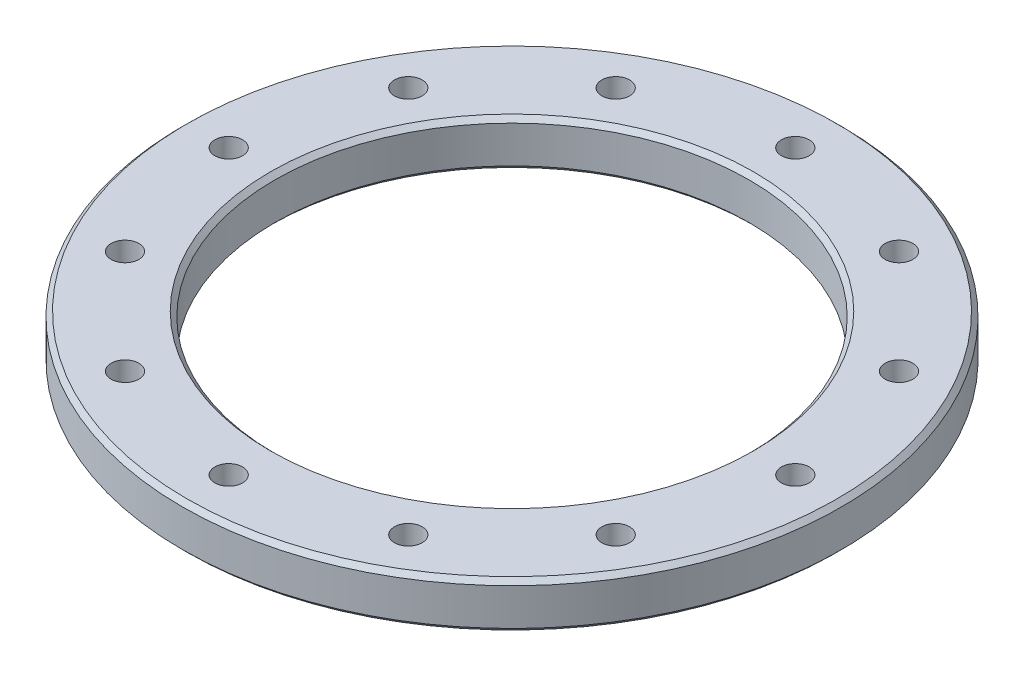
ISO-10303-21;
HEADER;
FILE_DESCRIPTION(('STEP AP214'),'2;1');
FILE_NAME('part.step','',(''),(''),'','','');
FILE_SCHEMA(('AUTOMOTIVE_DESIGN { 1 0 10303 214 1 1 1 1 }'));
ENDSEC;
DATA;
#1=APPLICATION_CONTEXT('core data for automotive mechanical design processes');
#2=APPLICATION_PROTOCOL_DEFINITION('international standard','automotive_design',2000,#1);
#3=PRODUCT_CONTEXT('',#1,'mechanical');
#4=PRODUCT('Part','Part','',(#3));
#5=PRODUCT_RELATED_PRODUCT_CATEGORY('part','',(#4));
#6=PRODUCT_DEFINITION_FORMATION('','',#4);
#7=PRODUCT_DEFINITION_CONTEXT('part definition',#1,'design');
#8=PRODUCT_DEFINITION('design','',#6,#7);
#9=PRODUCT_DEFINITION_SHAPE('','',#8);
#10=(LENGTH_UNIT() NAMED_UNIT(*) SI_UNIT(.MILLI.,.METRE.));
#11=(NAMED_UNIT(*) PLANE_ANGLE_UNIT() SI_UNIT($,.RADIAN.));
#12=(NAMED_UNIT(*) SI_UNIT($,.STERADIAN.) SOLID_ANGLE_UNIT());
#13=UNCERTAINTY_MEASURE_WITH_UNIT(LENGTH_MEASURE(1.E-05),#10,'distance_accuracy_value','');
#14=(GEOMETRIC_REPRESENTATION_CONTEXT(3) GLOBAL_UNCERTAINTY_ASSIGNED_CONTEXT((#13)) GLOBAL_UNIT_ASSIGNED_CONTEXT((#10,
#11,#12)) REPRESENTATION_CONTEXT('',''));
#15=CARTESIAN_POINT('',(0.,0.,0.));
#16=DIRECTION('',(0.,0.,1.));
#17=DIRECTION('',(1.,0.,0.));
#18=AXIS2_PLACEMENT_3D('',#15,#16,#17);
#19=CARTESIAN_POINT('',(0.,5.,0.));
#20=DIRECTION('',(0.,1.,0.));
#21=DIRECTION('',(0.,0.,1.));
#22=AXIS2_PLACEMENT_3D('',#19,#20,#21);
#23=PLANE('',#22);
#24=CARTESIAN_POINT('',(0.,5.,0.));
#25=DIRECTION('',(0.,1.,0.));
#26=DIRECTION('',(0.,0.,1.));
#27=AXIS2_PLACEMENT_3D('',#24,#25,#26);
#28=CIRCLE('',#27,35.125);
#29=CARTESIAN_POINT('',(0.,5.,35.125));
#30=VERTEX_POINT('',#29);
#31=EDGE_CURVE('E10',#30,#30,#28,.T.);
#32=ORIENTED_EDGE('',*,*,#31,.T.);
#33=EDGE_LOOP('',(#32));
#34=FACE_BOUND('',#33,.T.);
#35=CARTESIAN_POINT('',(0.,5.,0.));
#36=DIRECTION('',(0.,1.,0.));
#37=DIRECTION('',(0.,0.,1.));
#38=AXIS2_PLACEMENT_3D('',#35,#36,#37);
#39=CIRCLE('',#38,26.125);
#40=CARTESIAN_POINT('',(0.,5.,26.125));
#41=VERTEX_POINT('',#40);
#42=EDGE_CURVE('E38',#41,#41,#39,.F.);
#43=ORIENTED_EDGE('',*,*,#42,.T.);
#44=EDGE_LOOP('',(#43));
#45=FACE_BOUND('',#44,.T.);
#46=CARTESIAN_POINT('',(-26.5220279908985,5.,-15.3124999999999));
#47=DIRECTION('',(0.,1.,0.));
#48=DIRECTION('',(0.86602540378444,0.,0.499999999999998));
#49=AXIS2_PLACEMENT_3D('',#46,#47,#48);
#50=CIRCLE('',#49,1.5);
#51=CARTESIAN_POINT('',(-25.2229898852218,5.,-14.5624999999999));
#52=VERTEX_POINT('',#51);
#53=EDGE_CURVE('E117',#52,#52,#50,.T.);
#54=ORIENTED_EDGE('',*,*,#53,.F.);
#55=EDGE_LOOP('',(#54));
#56=FACE_BOUND('',#55,.T.);
#57=CARTESIAN_POINT('',(-30.625,5.,1.08495694713479E-13));
#58=DIRECTION('',(0.,1.,0.));
#59=DIRECTION('',(1.,0.,0.));
#60=AXIS2_PLACEMENT_3D('',#57,#58,#59);
#61=CIRCLE('',#60,1.5);
#62=CARTESIAN_POINT('',(-29.125,5.,1.03258472705214E-13));
#63=VERTEX_POINT('',#62);
#64=EDGE_CURVE('E111',#63,#63,#61,.T.);
#65=ORIENTED_EDGE('',*,*,#64,.F.);
#66=EDGE_LOOP('',(#65));
#67=FACE_BOUND('',#66,.T.);
#68=CARTESIAN_POINT('',(-26.5220279908984,5.,15.3125000000001));
#69=DIRECTION('',(0.,1.,0.));
#70=DIRECTION('',(0.866025403784436,0.,-0.500000000000004));
#71=AXIS2_PLACEMENT_3D('',#68,#69,#70);
#72=CIRCLE('',#71,1.5);
#73=CARTESIAN_POINT('',(-25.2229898852217,5.,14.5625000000001));
#74=VERTEX_POINT('',#73);
#75=EDGE_CURVE('E105',#74,#74,#72,.T.);
#76=ORIENTED_EDGE('',*,*,#75,.F.);
#77=EDGE_LOOP('',(#76));
#78=FACE_BOUND('',#77,.T.);
#79=CARTESIAN_POINT('',(-15.3124999999998,5.,26.5220279908985));
#80=DIRECTION('',(0.,1.,0.));
#81=DIRECTION('',(0.499999999999995,0.,-0.866025403784442));
#82=AXIS2_PLACEMENT_3D('',#79,#80,#81);
#83=CIRCLE('',#82,1.5);
#84=CARTESIAN_POINT('',(-14.5624999999999,5.,25.2229898852219));
#85=VERTEX_POINT('',#84);
#86=EDGE_CURVE('E99',#85,#85,#83,.T.);
#87=ORIENTED_EDGE('',*,*,#86,.F.);
#88=EDGE_LOOP('',(#87));
#89=FACE_BOUND('',#88,.T.);
#90=CARTESIAN_POINT('',(0.,5.,30.625));
#91=DIRECTION('',(0.,1.,0.));
#92=DIRECTION('',(0.,0.,-1.));
#93=AXIS2_PLACEMENT_3D('',#90,#91,#92);
#94=CIRCLE('',#93,1.5);
#95=CARTESIAN_POINT('',(0.,5.,29.125));
#96=VERTEX_POINT('',#95);
#97=EDGE_CURVE('E93',#96,#96,#94,.T.);
#98=ORIENTED_EDGE('',*,*,#97,.F.);
#99=EDGE_LOOP('',(#98));
#100=FACE_BOUND('',#99,.T.);
#101=CARTESIAN_POINT('',(15.3125000000002,5.,26.5220279908983));
#102=DIRECTION('',(0.,1.,0.));
#103=DIRECTION('',(-0.500000000000007,0.,-0.866025403784435));
#104=AXIS2_PLACEMENT_3D('',#101,#102,#103);
#105=CIRCLE('',#104,1.5);
#106=CARTESIAN_POINT('',(14.5625000000002,5.,25.2229898852217));
#107=VERTEX_POINT('',#106);
#108=EDGE_CURVE('E87',#107,#107,#105,.T.);
#109=ORIENTED_EDGE('',*,*,#108,.F.);
#110=EDGE_LOOP('',(#109));
#111=FACE_BOUND('',#110,.T.);
#112=CARTESIAN_POINT('',(26.5220279908986,5.,15.3124999999998));
#113=DIRECTION('',(0.,1.,0.));
#114=DIRECTION('',(-0.866025403784443,0.,-0.499999999999992));
#115=AXIS2_PLACEMENT_3D('',#112,#113,#114);
#116=CIRCLE('',#115,1.5);
#117=CARTESIAN_POINT('',(25.2229898852219,5.,14.5624999999998));
#118=VERTEX_POINT('',#117);
#119=EDGE_CURVE('E79',#118,#118,#116,.T.);
#120=ORIENTED_EDGE('',*,*,#119,.F.);
#121=EDGE_LOOP('',(#120));
#122=FACE_BOUND('',#121,.T.);
#123=CARTESIAN_POINT('',(30.625,5.,-3.22348926717621E-13));
#124=DIRECTION('',(0.,1.,0.));
#125=DIRECTION('',(-1.,0.,0.));
#126=AXIS2_PLACEMENT_3D('',#123,#124,#125);
#127=CIRCLE('',#126,1.5);
#128=CARTESIAN_POINT('',(29.125,5.,-3.06637260692826E-13));
#129=VERTEX_POINT('',#128);
#130=EDGE_CURVE('E80',#129,#129,#127,.T.);
#131=ORIENTED_EDGE('',*,*,#130,.F.);
#132=EDGE_LOOP('',(#131));
#133=FACE_BOUND('',#132,.T.);
#134=CARTESIAN_POINT('',(26.5220279908983,5.,-15.3125000000003));
#135=DIRECTION('',(0.,1.,0.));
#136=DIRECTION('',(-0.866025403784433,0.,0.50000000000001));
#137=AXIS2_PLACEMENT_3D('',#134,#135,#136);
#138=CIRCLE('',#137,1.5);
#139=CARTESIAN_POINT('',(25.2229898852216,5.,-14.5625000000003));
#140=VERTEX_POINT('',#139);
#141=EDGE_CURVE('E127',#140,#140,#138,.T.);
#142=ORIENTED_EDGE('',*,*,#141,.F.);
#143=EDGE_LOOP('',(#142));
#144=FACE_BOUND('',#143,.T.);
#145=CARTESIAN_POINT('',(15.3124999999997,5.,-26.5220279908986));
#146=DIRECTION('',(0.,1.,0.));
#147=DIRECTION('',(-0.499999999999989,0.,0.866025403784445));
#148=AXIS2_PLACEMENT_3D('',#145,#146,#147);
#149=CIRCLE('',#148,1.5);
#150=CARTESIAN_POINT('',(14.5624999999997,5.,-25.222989885222));
#151=VERTEX_POINT('',#150);
#152=EDGE_CURVE('E128',#151,#151,#149,.T.);
#153=ORIENTED_EDGE('',*,*,#152,.F.);
#154=EDGE_LOOP('',(#153));
#155=FACE_BOUND('',#154,.T.);
#156=CARTESIAN_POINT('',(-15.3125,5.,-26.5220279908984));
#157=DIRECTION('',(0.,1.,0.));
#158=DIRECTION('',(0.500000000000001,0.,0.866025403784438));
#159=AXIS2_PLACEMENT_3D('',#156,#157,#158);
#160=CIRCLE('',#159,1.5);
#161=CARTESIAN_POINT('',(-14.5625,5.,-25.2229898852218));
#162=VERTEX_POINT('',#161);
#163=EDGE_CURVE('E72',#162,#162,#160,.T.);
#164=ORIENTED_EDGE('',*,*,#163,.F.);
#165=EDGE_LOOP('',(#164));
#166=FACE_BOUND('',#165,.T.);
#167=CARTESIAN_POINT('',(0.,5.,-30.625));
#168=DIRECTION('',(0.,1.,0.));
#169=DIRECTION('',(0.,0.,1.));
#170=AXIS2_PLACEMENT_3D('',#167,#168,#169);
#171=CIRCLE('',#170,1.5);
#172=CARTESIAN_POINT('',(0.,5.,-29.125));
#173=VERTEX_POINT('',#172);
#174=EDGE_CURVE('E66',#173,#173,#171,.T.);
#175=ORIENTED_EDGE('',*,*,#174,.F.);
#176=EDGE_LOOP('',(#175));
#177=FACE_BOUND('',#176,.T.);
#178=ADVANCED_FACE('F31',(#34,#45,#56,#67,#78,#89,#100,#111,#122,#133,#144,#155,#166,#177),#23,.T.);
#179=CARTESIAN_POINT('',(0.,0.,0.));
#180=DIRECTION('',(0.,1.,0.));
#181=DIRECTION('',(0.,0.,1.));
#182=AXIS2_PLACEMENT_3D('',#179,#180,#181);
#183=PLANE('',#182);
#184=CARTESIAN_POINT('',(0.,0.,0.));
#185=DIRECTION('',(0.,1.,0.));
#186=DIRECTION('',(0.,0.,1.));
#187=AXIS2_PLACEMENT_3D('',#184,#185,#186);
#188=CIRCLE('',#187,26.125);
#189=CARTESIAN_POINT('',(0.,0.,26.125));
#190=VERTEX_POINT('',#189);
#191=EDGE_CURVE('E57',#190,#190,#188,.T.);
#192=ORIENTED_EDGE('',*,*,#191,.T.);
#193=EDGE_LOOP('',(#192));
#194=FACE_BOUND('',#193,.T.);
#195=CARTESIAN_POINT('',(0.,0.,0.));
#196=DIRECTION('',(0.,1.,0.));
#197=DIRECTION('',(0.,0.,1.));
#198=AXIS2_PLACEMENT_3D('',#195,#196,#197);
#199=CIRCLE('',#198,35.125);
#200=CARTESIAN_POINT('',(0.,0.,35.125));
#201=VERTEX_POINT('',#200);
#202=EDGE_CURVE('E60',#201,#201,#199,.F.);
#203=ORIENTED_EDGE('',*,*,#202,.T.);
#204=EDGE_LOOP('',(#203));
#205=FACE_BOUND('',#204,.T.);
#206=CARTESIAN_POINT('',(-26.5220279908985,0.,-15.3124999999999));
#207=DIRECTION('',(0.,1.,0.));
#208=DIRECTION('',(0.,0.,1.));
#209=AXIS2_PLACEMENT_3D('',#206,#207,#208);
#210=CIRCLE('',#209,1.5);
#211=CARTESIAN_POINT('',(-26.5220279908985,0.,-13.8124999999999));
#212=VERTEX_POINT('',#211);
#213=EDGE_CURVE('E75',#212,#212,#210,.F.);
#214=ORIENTED_EDGE('',*,*,#213,.F.);
#215=EDGE_LOOP('',(#214));
#216=FACE_BOUND('',#215,.T.);
#217=CARTESIAN_POINT('',(-30.625,0.,1.08495694713479E-13));
#218=DIRECTION('',(0.,1.,0.));
#219=DIRECTION('',(0.,0.,1.));
#220=AXIS2_PLACEMENT_3D('',#217,#218,#219);
#221=CIRCLE('',#220,1.5);
#222=CARTESIAN_POINT('',(-30.625,0.,1.50000000000011));
#223=VERTEX_POINT('',#222);
#224=EDGE_CURVE('E114',#223,#223,#221,.F.);
#225=ORIENTED_EDGE('',*,*,#224,.F.);
#226=EDGE_LOOP('',(#225));
#227=FACE_BOUND('',#226,.T.);
#228=CARTESIAN_POINT('',(-26.5220279908984,0.,15.3125000000001));
#229=DIRECTION('',(0.,1.,0.));
#230=DIRECTION('',(0.,0.,1.));
#231=AXIS2_PLACEMENT_3D('',#228,#229,#230);
#232=CIRCLE('',#231,1.5);
#233=CARTESIAN_POINT('',(-26.5220279908984,0.,16.8125000000001));
#234=VERTEX_POINT('',#233);
#235=EDGE_CURVE('E108',#234,#234,#232,.F.);
#236=ORIENTED_EDGE('',*,*,#235,.F.);
#237=EDGE_LOOP('',(#236));
#238=FACE_BOUND('',#237,.T.);
#239=CARTESIAN_POINT('',(-15.3124999999998,0.,26.5220279908985));
#240=DIRECTION('',(0.,1.,0.));
#241=DIRECTION('',(0.,0.,1.));
#242=AXIS2_PLACEMENT_3D('',#239,#240,#241);
#243=CIRCLE('',#242,1.5);
#244=CARTESIAN_POINT('',(-15.3124999999998,0.,28.0220279908985));
#245=VERTEX_POINT('',#244);
#246=EDGE_CURVE('E102',#245,#245,#243,.F.);
#247=ORIENTED_EDGE('',*,*,#246,.F.);
#248=EDGE_LOOP('',(#247));
#249=FACE_BOUND('',#248,.T.);
#250=CARTESIAN_POINT('',(0.,0.,30.625));
#251=DIRECTION('',(0.,1.,0.));
#252=DIRECTION('',(0.,0.,1.));
#253=AXIS2_PLACEMENT_3D('',#250,#251,#252);
#254=CIRCLE('',#253,1.5);
#255=CARTESIAN_POINT('',(0.,0.,32.125));
#256=VERTEX_POINT('',#255);
#257=EDGE_CURVE('E96',#256,#256,#254,.F.);
#258=ORIENTED_EDGE('',*,*,#257,.F.);
#259=EDGE_LOOP('',(#258));
#260=FACE_BOUND('',#259,.T.);
#261=CARTESIAN_POINT('',(15.3125000000002,0.,26.5220279908983));
#262=DIRECTION('',(0.,1.,0.));
#263=DIRECTION('',(0.,0.,1.));
#264=AXIS2_PLACEMENT_3D('',#261,#262,#263);
#265=CIRCLE('',#264,1.5);
#266=CARTESIAN_POINT('',(15.3125000000002,0.,28.0220279908983));
#267=VERTEX_POINT('',#266);
#268=EDGE_CURVE('E90',#267,#267,#265,.F.);
#269=ORIENTED_EDGE('',*,*,#268,.F.);
#270=EDGE_LOOP('',(#269));
#271=FACE_BOUND('',#270,.T.);
#272=CARTESIAN_POINT('',(26.5220279908986,0.,15.3124999999998));
#273=DIRECTION('',(0.,1.,0.));
#274=DIRECTION('',(0.,0.,1.));
#275=AXIS2_PLACEMENT_3D('',#272,#273,#274);
#276=CIRCLE('',#275,1.5);
#277=CARTESIAN_POINT('',(26.5220279908986,0.,16.8124999999998));
#278=VERTEX_POINT('',#277);
#279=EDGE_CURVE('E84',#278,#278,#276,.F.);
#280=ORIENTED_EDGE('',*,*,#279,.F.);
#281=EDGE_LOOP('',(#280));
#282=FACE_BOUND('',#281,.T.);
#283=CARTESIAN_POINT('',(30.625,0.,-3.22348926717621E-13));
#284=DIRECTION('',(0.,1.,0.));
#285=DIRECTION('',(0.,0.,1.));
#286=AXIS2_PLACEMENT_3D('',#283,#284,#285);
#287=CIRCLE('',#286,1.5);
#288=CARTESIAN_POINT('',(30.625,0.,1.49999999999968));
#289=VERTEX_POINT('',#288);
#290=EDGE_CURVE('E76',#289,#289,#287,.F.);
#291=ORIENTED_EDGE('',*,*,#290,.F.);
#292=EDGE_LOOP('',(#291));
#293=FACE_BOUND('',#292,.T.);
#294=CARTESIAN_POINT('',(26.5220279908983,0.,-15.3125000000003));
#295=DIRECTION('',(0.,1.,0.));
#296=DIRECTION('',(0.,0.,1.));
#297=AXIS2_PLACEMENT_3D('',#294,#295,#296);
#298=CIRCLE('',#297,1.5);
#299=CARTESIAN_POINT('',(26.5220279908983,0.,-13.8125000000003));
#300=VERTEX_POINT('',#299);
#301=EDGE_CURVE('E83',#300,#300,#298,.F.);
#302=ORIENTED_EDGE('',*,*,#301,.F.);
#303=EDGE_LOOP('',(#302));
#304=FACE_BOUND('',#303,.T.);
#305=CARTESIAN_POINT('',(15.3124999999997,0.,-26.5220279908986));
#306=DIRECTION('',(0.,1.,0.));
#307=DIRECTION('',(0.,0.,1.));
#308=AXIS2_PLACEMENT_3D('',#305,#306,#307);
#309=CIRCLE('',#308,1.5);
#310=CARTESIAN_POINT('',(15.3124999999997,0.,-25.0220279908986));
#311=VERTEX_POINT('',#310);
#312=EDGE_CURVE('E124',#311,#311,#309,.F.);
#313=ORIENTED_EDGE('',*,*,#312,.F.);
#314=EDGE_LOOP('',(#313));
#315=FACE_BOUND('',#314,.T.);
#316=CARTESIAN_POINT('',(-15.3125,0.,-26.5220279908984));
#317=DIRECTION('',(0.,1.,0.));
#318=DIRECTION('',(0.,0.,1.));
#319=AXIS2_PLACEMENT_3D('',#316,#317,#318);
#320=CIRCLE('',#319,1.5);
#321=CARTESIAN_POINT('',(-15.3125,0.,-25.0220279908984));
#322=VERTEX_POINT('',#321);
#323=EDGE_CURVE('E69',#322,#322,#320,.F.);
#324=ORIENTED_EDGE('',*,*,#323,.F.);
#325=EDGE_LOOP('',(#324));
#326=FACE_BOUND('',#325,.T.);
#327=CARTESIAN_POINT('',(0.,0.,-30.625));
#328=DIRECTION('',(0.,1.,0.));
#329=DIRECTION('',(0.,0.,1.));
#330=AXIS2_PLACEMENT_3D('',#327,#328,#329);
#331=CIRCLE('',#330,1.5);
#332=CARTESIAN_POINT('',(0.,0.,-29.125));
#333=VERTEX_POINT('',#332);
#334=EDGE_CURVE('E63',#333,#333,#331,.F.);
#335=ORIENTED_EDGE('',*,*,#334,.F.);
#336=EDGE_LOOP('',(#335));
#337=FACE_BOUND('',#336,.T.);
#338=ADVANCED_FACE('F141',(#194,#205,#216,#227,#238,#249,#260,#271,#282,#293,#304,#315,#326,
#337),#183,.F.);
#339=CARTESIAN_POINT('',(0.,5.,0.));
#340=DIRECTION('',(0.,-1.,0.));
#341=DIRECTION('',(0.,0.,-1.));
#342=AXIS2_PLACEMENT_3D('',#339,#340,#341);
#343=CYLINDRICAL_SURFACE('',#342,35.625);
#344=CARTESIAN_POINT('',(0.,0.500000000000007,0.));
#345=DIRECTION('',(0.,1.,0.));
#346=DIRECTION('',(0.,0.,1.));
#347=AXIS2_PLACEMENT_3D('',#344,#345,#346);
#348=CIRCLE('',#347,35.625);
#349=CARTESIAN_POINT('',(0.,0.500000000000007,35.625));
#350=VERTEX_POINT('',#349);
#351=EDGE_CURVE('E42',#350,#350,#348,.T.);
#352=ORIENTED_EDGE('',*,*,#351,.T.);
#353=EDGE_LOOP('',(#352));
#354=FACE_BOUND('',#353,.T.);
#355=CARTESIAN_POINT('',(0.,4.50000000000002,0.));
#356=DIRECTION('',(0.,1.,0.));
#357=DIRECTION('',(0.,0.,1.));
#358=AXIS2_PLACEMENT_3D('',#355,#356,#357);
#359=CIRCLE('',#358,35.625);
#360=CARTESIAN_POINT('',(0.,4.50000000000002,35.625));
#361=VERTEX_POINT('',#360);
#362=EDGE_CURVE('E46',#361,#361,#359,.F.);
#363=ORIENTED_EDGE('',*,*,#362,.T.);
#364=EDGE_LOOP('',(#363));
#365=FACE_BOUND('',#364,.T.);
#366=ADVANCED_FACE('F158',(#354,#365),#343,.T.);
#367=CARTESIAN_POINT('',(0.,5.,0.));
#368=DIRECTION('',(0.,-1.,0.));
#369=DIRECTION('',(0.,0.,-1.));
#370=AXIS2_PLACEMENT_3D('',#367,#368,#369);
#371=CYLINDRICAL_SURFACE('',#370,25.625);
#372=CARTESIAN_POINT('',(0.,0.500000000000011,0.));
#373=DIRECTION('',(0.,1.,0.));
#374=DIRECTION('',(0.,0.,1.));
#375=AXIS2_PLACEMENT_3D('',#372,#373,#374);
#376=CIRCLE('',#375,25.625);
#377=CARTESIAN_POINT('',(0.,0.500000000000011,25.625));
#378=VERTEX_POINT('',#377);
#379=EDGE_CURVE('E51',#378,#378,#376,.F.);
#380=ORIENTED_EDGE('',*,*,#379,.T.);
#381=EDGE_LOOP('',(#380));
#382=FACE_BOUND('',#381,.T.);
#383=CARTESIAN_POINT('',(0.,4.50000000000001,0.));
#384=DIRECTION('',(0.,1.,0.));
#385=DIRECTION('',(0.,0.,1.));
#386=AXIS2_PLACEMENT_3D('',#383,#384,#385);
#387=CIRCLE('',#386,25.625);
#388=CARTESIAN_POINT('',(0.,4.50000000000001,25.625));
#389=VERTEX_POINT('',#388);
#390=EDGE_CURVE('E54',#389,#389,#387,.T.);
#391=ORIENTED_EDGE('',*,*,#390,.T.);
#392=EDGE_LOOP('',(#391));
#393=FACE_BOUND('',#392,.T.);
#394=ADVANCED_FACE('F153',(#382,#393),#371,.F.);
#395=CARTESIAN_POINT('',(0.,-0.00100000000000013,-30.625));
#396=DIRECTION('',(0.,1.,0.));
#397=DIRECTION('',(0.,0.,1.));
#398=AXIS2_PLACEMENT_3D('',#395,#396,#397);
#399=CYLINDRICAL_SURFACE('',#398,1.5);
#400=ORIENTED_EDGE('',*,*,#174,.T.);
#401=EDGE_LOOP('',(#400));
#402=FACE_BOUND('',#401,.T.);
#403=ORIENTED_EDGE('',*,*,#334,.T.);
#404=EDGE_LOOP('',(#403));
#405=FACE_BOUND('',#404,.T.);
#406=ADVANCED_FACE('F149',(#402,#405),#399,.F.);
#407=CARTESIAN_POINT('',(-15.3125,-0.00100000000000013,-26.5220279908984));
#408=DIRECTION('',(0.,1.,0.));
#409=DIRECTION('',(0.,0.,1.));
#410=AXIS2_PLACEMENT_3D('',#407,#408,#409);
#411=CYLINDRICAL_SURFACE('',#410,1.5);
#412=ORIENTED_EDGE('',*,*,#163,.T.);
#413=EDGE_LOOP('',(#412));
#414=FACE_BOUND('',#413,.T.);
#415=ORIENTED_EDGE('',*,*,#323,.T.);
#416=EDGE_LOOP('',(#415));
#417=FACE_BOUND('',#416,.T.);
#418=ADVANCED_FACE('F152',(#414,#417),#411,.F.);
#419=CARTESIAN_POINT('',(15.3124999999997,-0.00100000000000013,-26.5220279908986));
#420=DIRECTION('',(0.,1.,0.));
#421=DIRECTION('',(0.,0.,1.));
#422=AXIS2_PLACEMENT_3D('',#419,#420,#421);
#423=CYLINDRICAL_SURFACE('',#422,1.5);
#424=ORIENTED_EDGE('',*,*,#152,.T.);
#425=EDGE_LOOP('',(#424));
#426=FACE_BOUND('',#425,.T.);
#427=ORIENTED_EDGE('',*,*,#312,.T.);
#428=EDGE_LOOP('',(#427));
#429=FACE_BOUND('',#428,.T.);
#430=ADVANCED_FACE('F199',(#426,#429),#423,.F.);
#431=CARTESIAN_POINT('',(26.5220279908983,-0.00100000000000013,-15.3125000000003));
#432=DIRECTION('',(0.,1.,0.));
#433=DIRECTION('',(0.,0.,1.));
#434=AXIS2_PLACEMENT_3D('',#431,#432,#433);
#435=CYLINDRICAL_SURFACE('',#434,1.5);
#436=ORIENTED_EDGE('',*,*,#141,.T.);
#437=EDGE_LOOP('',(#436));
#438=FACE_BOUND('',#437,.T.);
#439=ORIENTED_EDGE('',*,*,#301,.T.);
#440=EDGE_LOOP('',(#439));
#441=FACE_BOUND('',#440,.T.);
#442=ADVANCED_FACE('F136',(#438,#441),#435,.F.);
#443=CARTESIAN_POINT('',(30.625,-0.00100000000000013,-3.22348926717621E-13));
#444=DIRECTION('',(0.,1.,0.));
#445=DIRECTION('',(0.,0.,1.));
#446=AXIS2_PLACEMENT_3D('',#443,#444,#445);
#447=CYLINDRICAL_SURFACE('',#446,1.5);
#448=ORIENTED_EDGE('',*,*,#130,.T.);
#449=EDGE_LOOP('',(#448));
#450=FACE_BOUND('',#449,.T.);
#451=ORIENTED_EDGE('',*,*,#290,.T.);
#452=EDGE_LOOP('',(#451));
#453=FACE_BOUND('',#452,.T.);
#454=ADVANCED_FACE('F201',(#450,#453),#447,.F.);
#455=CARTESIAN_POINT('',(26.5220279908986,-0.00100000000000013,15.3124999999998));
#456=DIRECTION('',(0.,1.,0.));
#457=DIRECTION('',(0.,0.,1.));
#458=AXIS2_PLACEMENT_3D('',#455,#456,#457);
#459=CYLINDRICAL_SURFACE('',#458,1.5);
#460=ORIENTED_EDGE('',*,*,#119,.T.);
#461=EDGE_LOOP('',(#460));
#462=FACE_BOUND('',#461,.T.);
#463=ORIENTED_EDGE('',*,*,#279,.T.);
#464=EDGE_LOOP('',(#463));
#465=FACE_BOUND('',#464,.T.);
#466=ADVANCED_FACE('F204',(#462,#465),#459,.F.);
#467=CARTESIAN_POINT('',(15.3125000000002,-0.00100000000000013,26.5220279908983));
#468=DIRECTION('',(0.,1.,0.));
#469=DIRECTION('',(0.,0.,1.));
#470=AXIS2_PLACEMENT_3D('',#467,#468,#469);
#471=CYLINDRICAL_SURFACE('',#470,1.5);
#472=ORIENTED_EDGE('',*,*,#108,.T.);
#473=EDGE_LOOP('',(#472));
#474=FACE_BOUND('',#473,.T.);
#475=ORIENTED_EDGE('',*,*,#268,.T.);
#476=EDGE_LOOP('',(#475));
#477=FACE_BOUND('',#476,.T.);
#478=ADVANCED_FACE('F208',(#474,#477),#471,.F.);
#479=CARTESIAN_POINT('',(0.,-0.00100000000000013,30.625));
#480=DIRECTION('',(0.,1.,0.));
#481=DIRECTION('',(0.,0.,1.));
#482=AXIS2_PLACEMENT_3D('',#479,#480,#481);
#483=CYLINDRICAL_SURFACE('',#482,1.5);
#484=ORIENTED_EDGE('',*,*,#97,.T.);
#485=EDGE_LOOP('',(#484));
#486=FACE_BOUND('',#485,.T.);
#487=ORIENTED_EDGE('',*,*,#257,.T.);
#488=EDGE_LOOP('',(#487));
#489=FACE_BOUND('',#488,.T.);
#490=ADVANCED_FACE('F212',(#486,#489),#483,.F.);
#491=CARTESIAN_POINT('',(-15.3124999999998,-0.00100000000000013,26.5220279908985));
#492=DIRECTION('',(0.,1.,0.));
#493=DIRECTION('',(0.,0.,1.));
#494=AXIS2_PLACEMENT_3D('',#491,#492,#493);
#495=CYLINDRICAL_SURFACE('',#494,1.5);
#496=ORIENTED_EDGE('',*,*,#86,.T.);
#497=EDGE_LOOP('',(#496));
#498=FACE_BOUND('',#497,.T.);
#499=ORIENTED_EDGE('',*,*,#246,.T.);
#500=EDGE_LOOP('',(#499));
#501=FACE_BOUND('',#500,.T.);
#502=ADVANCED_FACE('F216',(#498,#501),#495,.F.);
#503=CARTESIAN_POINT('',(-26.5220279908984,-0.00100000000000013,15.3125000000001));
#504=DIRECTION('',(0.,1.,0.));
#505=DIRECTION('',(0.,0.,1.));
#506=AXIS2_PLACEMENT_3D('',#503,#504,#505);
#507=CYLINDRICAL_SURFACE('',#506,1.5);
#508=ORIENTED_EDGE('',*,*,#75,.T.);
#509=EDGE_LOOP('',(#508));
#510=FACE_BOUND('',#509,.T.);
#511=ORIENTED_EDGE('',*,*,#235,.T.);
#512=EDGE_LOOP('',(#511));
#513=FACE_BOUND('',#512,.T.);
#514=ADVANCED_FACE('F220',(#510,#513),#507,.F.);
#515=CARTESIAN_POINT('',(-30.625,-0.00100000000000013,1.08495694713479E-13));
#516=DIRECTION('',(0.,1.,0.));
#517=DIRECTION('',(0.,0.,1.));
#518=AXIS2_PLACEMENT_3D('',#515,#516,#517);
#519=CYLINDRICAL_SURFACE('',#518,1.5);
#520=ORIENTED_EDGE('',*,*,#64,.T.);
#521=EDGE_LOOP('',(#520));
#522=FACE_BOUND('',#521,.T.);
#523=ORIENTED_EDGE('',*,*,#224,.T.);
#524=EDGE_LOOP('',(#523));
#525=FACE_BOUND('',#524,.T.);
#526=ADVANCED_FACE('F224',(#522,#525),#519,.F.);
#527=CARTESIAN_POINT('',(-26.5220279908985,-0.00100000000000013,-15.3124999999999));
#528=DIRECTION('',(0.,1.,0.));
#529=DIRECTION('',(0.,0.,1.));
#530=AXIS2_PLACEMENT_3D('',#527,#528,#529);
#531=CYLINDRICAL_SURFACE('',#530,1.5);
#532=ORIENTED_EDGE('',*,*,#53,.T.);
#533=EDGE_LOOP('',(#532));
#534=FACE_BOUND('',#533,.T.);
#535=ORIENTED_EDGE('',*,*,#213,.T.);
#536=EDGE_LOOP('',(#535));
#537=FACE_BOUND('',#536,.T.);
#538=ADVANCED_FACE('F173',(#534,#537),#531,.F.);
#539=CARTESIAN_POINT('',(0.,0.,0.));
#540=DIRECTION('',(0.,-1.,0.));
#541=DIRECTION('',(0.,0.,-1.));
#542=AXIS2_PLACEMENT_3D('',#539,#540,#541);
#543=CONICAL_SURFACE('',#542,26.125,0.785398163397434);
#544=ORIENTED_EDGE('',*,*,#379,.F.);
#545=EDGE_LOOP('',(#544));
#546=FACE_BOUND('',#545,.T.);
#547=ORIENTED_EDGE('',*,*,#191,.F.);
#548=EDGE_LOOP('',(#547));
#549=FACE_BOUND('',#548,.T.);
#550=ADVANCED_FACE('F169',(#546,#549),#543,.F.);
#551=CARTESIAN_POINT('',(0.,0.500000000000007,0.));
#552=DIRECTION('',(0.,1.,0.));
#553=DIRECTION('',(0.,0.,1.));
#554=AXIS2_PLACEMENT_3D('',#551,#552,#553);
#555=CONICAL_SURFACE('',#554,35.625,0.785398163397448);
#556=ORIENTED_EDGE('',*,*,#202,.F.);
#557=EDGE_LOOP('',(#556));
#558=FACE_BOUND('',#557,.T.);
#559=ORIENTED_EDGE('',*,*,#351,.F.);
#560=EDGE_LOOP('',(#559));
#561=FACE_BOUND('',#560,.T.);
#562=ADVANCED_FACE('F172',(#558,#561),#555,.T.);
#563=CARTESIAN_POINT('',(0.,5.,0.));
#564=DIRECTION('',(0.,-1.,0.));
#565=DIRECTION('',(0.,0.,-1.));
#566=AXIS2_PLACEMENT_3D('',#563,#564,#565);
#567=CONICAL_SURFACE('',#566,35.125,0.785398163397462);
#568=ORIENTED_EDGE('',*,*,#362,.F.);
#569=EDGE_LOOP('',(#568));
#570=FACE_BOUND('',#569,.T.);
#571=ORIENTED_EDGE('',*,*,#31,.F.);
#572=EDGE_LOOP('',(#571));
#573=FACE_BOUND('',#572,.T.);
#574=ADVANCED_FACE('F176',(#570,#573),#567,.T.);
#575=CARTESIAN_POINT('',(0.,4.50000000000001,0.));
#576=DIRECTION('',(0.,1.,0.));
#577=DIRECTION('',(0.,0.,1.));
#578=AXIS2_PLACEMENT_3D('',#575,#576,#577);
#579=CONICAL_SURFACE('',#578,25.625,0.785398163397441);
#580=ORIENTED_EDGE('',*,*,#42,.F.);
#581=EDGE_LOOP('',(#580));
#582=FACE_BOUND('',#581,.T.);
#583=ORIENTED_EDGE('',*,*,#390,.F.);
#584=EDGE_LOOP('',(#583));
#585=FACE_BOUND('',#584,.T.);
#586=ADVANCED_FACE('F33',(#582,#585),#579,.F.);
#587=CLOSED_SHELL('',(#178,#338,#366,#394,#406,#418,#430,#442,#454,#466,#478,#490,#502,#514,
#526,#538,#550,#562,#574,#586));
#588=MANIFOLD_SOLID_BREP('B2',#587);
#589=ADVANCED_BREP_SHAPE_REPRESENTATION('',(#18,#588),#14);
#590=SHAPE_DEFINITION_REPRESENTATION(#9,#589);
ENDSEC;
END-ISO-10303-21;
